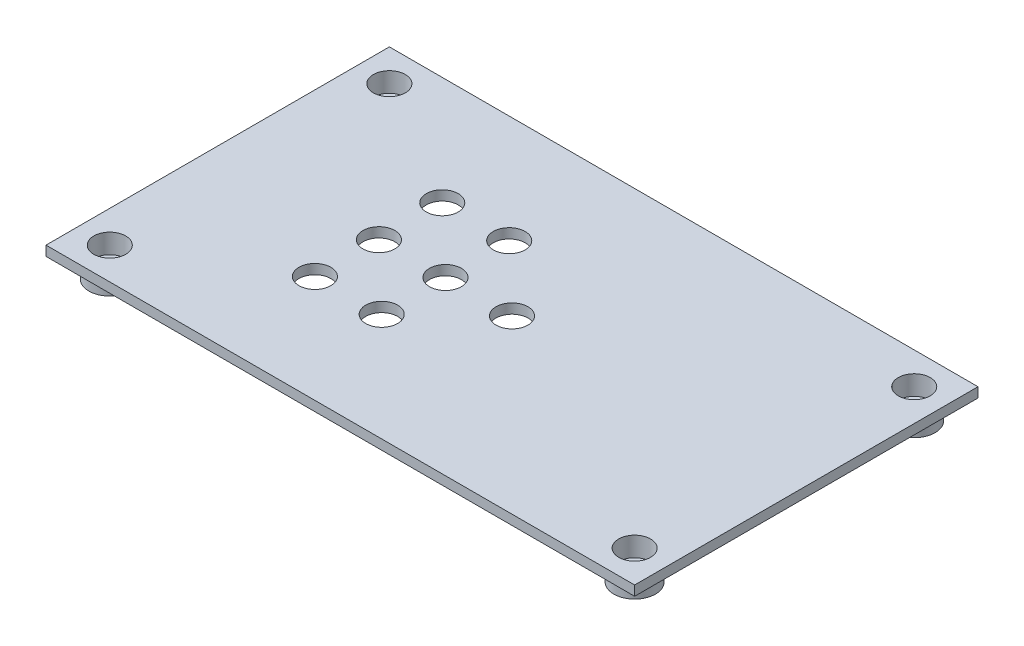
ISO-10303-21;
HEADER;
FILE_DESCRIPTION(('STEP AP214'),'2;1');
FILE_NAME('part.step','',(''),(''),'','','');
FILE_SCHEMA(('AUTOMOTIVE_DESIGN { 1 0 10303 214 1 1 1 1 }'));
ENDSEC;
DATA;
#1=APPLICATION_CONTEXT('core data for automotive mechanical design processes');
#2=APPLICATION_PROTOCOL_DEFINITION('international standard','automotive_design',2000,#1);
#3=PRODUCT_CONTEXT('',#1,'mechanical');
#4=PRODUCT('Part','Part','',(#3));
#5=PRODUCT_RELATED_PRODUCT_CATEGORY('part','',(#4));
#6=PRODUCT_DEFINITION_FORMATION('','',#4);
#7=PRODUCT_DEFINITION_CONTEXT('part definition',#1,'design');
#8=PRODUCT_DEFINITION('design','',#6,#7);
#9=PRODUCT_DEFINITION_SHAPE('','',#8);
#10=(LENGTH_UNIT() NAMED_UNIT(*) SI_UNIT(.MILLI.,.METRE.));
#11=(NAMED_UNIT(*) PLANE_ANGLE_UNIT() SI_UNIT($,.RADIAN.));
#12=(NAMED_UNIT(*) SI_UNIT($,.STERADIAN.) SOLID_ANGLE_UNIT());
#13=UNCERTAINTY_MEASURE_WITH_UNIT(LENGTH_MEASURE(1.E-05),#10,'distance_accuracy_value','');
#14=(GEOMETRIC_REPRESENTATION_CONTEXT(3) GLOBAL_UNCERTAINTY_ASSIGNED_CONTEXT((#13)) GLOBAL_UNIT_ASSIGNED_CONTEXT((#10,
#11,#12)) REPRESENTATION_CONTEXT('',''));
#15=CARTESIAN_POINT('',(0.,0.,0.));
#16=DIRECTION('',(0.,0.,1.));
#17=DIRECTION('',(1.,0.,0.));
#18=AXIS2_PLACEMENT_3D('',#15,#16,#17);
#19=CARTESIAN_POINT('',(53.5,-6.,28.5));
#20=DIRECTION('',(0.,1.,0.));
#21=DIRECTION('',(0.,0.,1.));
#22=AXIS2_PLACEMENT_3D('',#19,#20,#21);
#23=CYLINDRICAL_SURFACE('',#22,1.75);
#24=CARTESIAN_POINT('',(53.5,-4.,28.5));
#25=DIRECTION('',(0.,1.,0.));
#26=DIRECTION('',(0.,0.,1.));
#27=AXIS2_PLACEMENT_3D('',#24,#25,#26);
#28=CIRCLE('',#27,1.75);
#29=CARTESIAN_POINT('',(53.5,-4.,30.25));
#30=VERTEX_POINT('',#29);
#31=EDGE_CURVE('E155',#30,#30,#28,.T.);
#32=ORIENTED_EDGE('',*,*,#31,.F.);
#33=EDGE_LOOP('',(#32));
#34=FACE_BOUND('',#33,.T.);
#35=CARTESIAN_POINT('',(53.5,-2.,28.5));
#36=DIRECTION('',(0.,1.,0.));
#37=DIRECTION('',(0.,0.,1.));
#38=AXIS2_PLACEMENT_3D('',#35,#36,#37);
#39=CIRCLE('',#38,1.75);
#40=CARTESIAN_POINT('',(53.5,-2.,30.25));
#41=VERTEX_POINT('',#40);
#42=EDGE_CURVE('E39',#41,#41,#39,.F.);
#43=ORIENTED_EDGE('',*,*,#42,.F.);
#44=EDGE_LOOP('',(#43));
#45=FACE_BOUND('',#44,.T.);
#46=ADVANCED_FACE('F35',(#34,#45),#23,.F.);
#47=CARTESIAN_POINT('',(-53.5,-6.,-28.5));
#48=DIRECTION('',(0.,1.,0.));
#49=DIRECTION('',(0.,0.,1.));
#50=AXIS2_PLACEMENT_3D('',#47,#48,#49);
#51=CYLINDRICAL_SURFACE('',#50,1.75);
#52=CARTESIAN_POINT('',(-53.5,-4.,-28.5));
#53=DIRECTION('',(0.,1.,0.));
#54=DIRECTION('',(0.,0.,1.));
#55=AXIS2_PLACEMENT_3D('',#52,#53,#54);
#56=CIRCLE('',#55,1.75);
#57=CARTESIAN_POINT('',(-53.5,-4.,-26.75));
#58=VERTEX_POINT('',#57);
#59=EDGE_CURVE('E158',#58,#58,#56,.T.);
#60=ORIENTED_EDGE('',*,*,#59,.F.);
#61=EDGE_LOOP('',(#60));
#62=FACE_BOUND('',#61,.T.);
#63=CARTESIAN_POINT('',(-53.5,-2.,-28.5));
#64=DIRECTION('',(0.,1.,0.));
#65=DIRECTION('',(0.,0.,1.));
#66=AXIS2_PLACEMENT_3D('',#63,#64,#65);
#67=CIRCLE('',#66,1.75);
#68=CARTESIAN_POINT('',(-53.5,-2.,-26.75));
#69=VERTEX_POINT('',#68);
#70=EDGE_CURVE('E174',#69,#69,#67,.F.);
#71=ORIENTED_EDGE('',*,*,#70,.F.);
#72=EDGE_LOOP('',(#71));
#73=FACE_BOUND('',#72,.T.);
#74=ADVANCED_FACE('F184',(#62,#73),#51,.F.);
#75=CARTESIAN_POINT('',(-53.5,-6.,28.5));
#76=DIRECTION('',(0.,1.,0.));
#77=DIRECTION('',(0.,0.,1.));
#78=AXIS2_PLACEMENT_3D('',#75,#76,#77);
#79=CYLINDRICAL_SURFACE('',#78,1.75);
#80=CARTESIAN_POINT('',(-53.5,-4.,28.5));
#81=DIRECTION('',(0.,1.,0.));
#82=DIRECTION('',(0.,0.,1.));
#83=AXIS2_PLACEMENT_3D('',#80,#81,#82);
#84=CIRCLE('',#83,1.75);
#85=CARTESIAN_POINT('',(-53.5,-4.,30.25));
#86=VERTEX_POINT('',#85);
#87=EDGE_CURVE('E161',#86,#86,#84,.T.);
#88=ORIENTED_EDGE('',*,*,#87,.F.);
#89=EDGE_LOOP('',(#88));
#90=FACE_BOUND('',#89,.T.);
#91=CARTESIAN_POINT('',(-53.5,-2.,28.5));
#92=DIRECTION('',(0.,1.,0.));
#93=DIRECTION('',(0.,0.,1.));
#94=AXIS2_PLACEMENT_3D('',#91,#92,#93);
#95=CIRCLE('',#94,1.75);
#96=CARTESIAN_POINT('',(-53.5,-2.,30.25));
#97=VERTEX_POINT('',#96);
#98=EDGE_CURVE('E171',#97,#97,#95,.F.);
#99=ORIENTED_EDGE('',*,*,#98,.F.);
#100=EDGE_LOOP('',(#99));
#101=FACE_BOUND('',#100,.T.);
#102=ADVANCED_FACE('F190',(#90,#101),#79,.F.);
#103=CARTESIAN_POINT('',(53.5,-6.,-28.5));
#104=DIRECTION('',(0.,1.,0.));
#105=DIRECTION('',(0.,0.,1.));
#106=AXIS2_PLACEMENT_3D('',#103,#104,#105);
#107=CYLINDRICAL_SURFACE('',#106,1.75);
#108=CARTESIAN_POINT('',(53.5,-4.,-28.5));
#109=DIRECTION('',(0.,1.,0.));
#110=DIRECTION('',(0.,0.,1.));
#111=AXIS2_PLACEMENT_3D('',#108,#109,#110);
#112=CIRCLE('',#111,1.75);
#113=CARTESIAN_POINT('',(53.5,-4.,-26.75));
#114=VERTEX_POINT('',#113);
#115=EDGE_CURVE('E164',#114,#114,#112,.T.);
#116=ORIENTED_EDGE('',*,*,#115,.F.);
#117=EDGE_LOOP('',(#116));
#118=FACE_BOUND('',#117,.T.);
#119=CARTESIAN_POINT('',(53.5,-2.,-28.5));
#120=DIRECTION('',(0.,1.,0.));
#121=DIRECTION('',(0.,0.,1.));
#122=AXIS2_PLACEMENT_3D('',#119,#120,#121);
#123=CIRCLE('',#122,1.75);
#124=CARTESIAN_POINT('',(53.5,-2.,-26.75));
#125=VERTEX_POINT('',#124);
#126=EDGE_CURVE('E168',#125,#125,#123,.F.);
#127=ORIENTED_EDGE('',*,*,#126,.F.);
#128=EDGE_LOOP('',(#127));
#129=FACE_BOUND('',#128,.T.);
#130=ADVANCED_FACE('F197',(#118,#129),#107,.F.);
#131=CARTESIAN_POINT('',(-60.,2.,-35.));
#132=DIRECTION('',(0.,0.,-1.));
#133=DIRECTION('',(-1.,0.,0.));
#134=AXIS2_PLACEMENT_3D('',#131,#132,#133);
#135=PLANE('',#134);
#136=DIRECTION('',(1.,0.,0.));
#137=VECTOR('',#136,1.);
#138=CARTESIAN_POINT('',(-60.,0.,-35.));
#139=LINE('',#138,#137);
#140=CARTESIAN_POINT('',(-60.,0.,-35.));
#141=VERTEX_POINT('',#140);
#142=CARTESIAN_POINT('',(60.,0.,-35.));
#143=VERTEX_POINT('',#142);
#144=EDGE_CURVE('E107',#141,#143,#139,.T.);
#145=ORIENTED_EDGE('',*,*,#144,.F.);
#146=DIRECTION('',(0.,-1.,0.));
#147=VECTOR('',#146,1.);
#148=CARTESIAN_POINT('',(-60.,2.,-35.));
#149=LINE('',#148,#147);
#150=CARTESIAN_POINT('',(-60.,2.,-35.));
#151=VERTEX_POINT('',#150);
#152=EDGE_CURVE('E54',#151,#141,#149,.T.);
#153=ORIENTED_EDGE('',*,*,#152,.F.);
#154=DIRECTION('',(1.,0.,0.));
#155=VECTOR('',#154,1.);
#156=CARTESIAN_POINT('',(-60.,2.,-35.));
#157=LINE('',#156,#155);
#158=CARTESIAN_POINT('',(60.,2.,-35.));
#159=VERTEX_POINT('',#158);
#160=EDGE_CURVE('E101',#151,#159,#157,.T.);
#161=ORIENTED_EDGE('',*,*,#160,.T.);
#162=DIRECTION('',(0.,-1.,0.));
#163=VECTOR('',#162,1.);
#164=CARTESIAN_POINT('',(60.,2.,-35.));
#165=LINE('',#164,#163);
#166=EDGE_CURVE('E79',#159,#143,#165,.T.);
#167=ORIENTED_EDGE('',*,*,#166,.T.);
#168=EDGE_LOOP('',(#145,#153,#161,#167));
#169=FACE_BOUND('',#168,.T.);
#170=ADVANCED_FACE('F37',(#169),#135,.T.);
#171=CARTESIAN_POINT('',(-60.,2.,-35.));
#172=DIRECTION('',(1.,0.,0.));
#173=DIRECTION('',(0.,0.,-1.));
#174=AXIS2_PLACEMENT_3D('',#171,#172,#173);
#175=PLANE('',#174);
#176=DIRECTION('',(0.,0.,1.));
#177=VECTOR('',#176,1.);
#178=CARTESIAN_POINT('',(-60.,0.,-35.));
#179=LINE('',#178,#177);
#180=CARTESIAN_POINT('',(-60.,0.,35.));
#181=VERTEX_POINT('',#180);
#182=EDGE_CURVE('E71',#141,#181,#179,.T.);
#183=ORIENTED_EDGE('',*,*,#182,.T.);
#184=DIRECTION('',(0.,-1.,0.));
#185=VECTOR('',#184,1.);
#186=CARTESIAN_POINT('',(-60.,2.,35.));
#187=LINE('',#186,#185);
#188=CARTESIAN_POINT('',(-60.,2.,35.));
#189=VERTEX_POINT('',#188);
#190=EDGE_CURVE('E98',#189,#181,#187,.T.);
#191=ORIENTED_EDGE('',*,*,#190,.F.);
#192=DIRECTION('',(0.,0.,1.));
#193=VECTOR('',#192,1.);
#194=CARTESIAN_POINT('',(-60.,2.,-35.));
#195=LINE('',#194,#193);
#196=EDGE_CURVE('E89',#151,#189,#195,.T.);
#197=ORIENTED_EDGE('',*,*,#196,.F.);
#198=ORIENTED_EDGE('',*,*,#152,.T.);
#199=EDGE_LOOP('',(#183,#191,#197,#198));
#200=FACE_BOUND('',#199,.T.);
#201=ADVANCED_FACE('F285',(#200),#175,.F.);
#202=CARTESIAN_POINT('',(-60.,2.,35.));
#203=DIRECTION('',(0.,0.,-1.));
#204=DIRECTION('',(-1.,0.,0.));
#205=AXIS2_PLACEMENT_3D('',#202,#203,#204);
#206=PLANE('',#205);
#207=DIRECTION('',(1.,0.,0.));
#208=VECTOR('',#207,1.);
#209=CARTESIAN_POINT('',(-60.,0.,35.));
#210=LINE('',#209,#208);
#211=CARTESIAN_POINT('',(60.,0.,35.));
#212=VERTEX_POINT('',#211);
#213=EDGE_CURVE('E96',#181,#212,#210,.T.);
#214=ORIENTED_EDGE('',*,*,#213,.T.);
#215=DIRECTION('',(0.,-1.,0.));
#216=VECTOR('',#215,1.);
#217=CARTESIAN_POINT('',(60.,2.,35.));
#218=LINE('',#217,#216);
#219=CARTESIAN_POINT('',(60.,2.,35.));
#220=VERTEX_POINT('',#219);
#221=EDGE_CURVE('E93',#220,#212,#218,.T.);
#222=ORIENTED_EDGE('',*,*,#221,.F.);
#223=DIRECTION('',(1.,0.,0.));
#224=VECTOR('',#223,1.);
#225=CARTESIAN_POINT('',(-60.,2.,35.));
#226=LINE('',#225,#224);
#227=EDGE_CURVE('E84',#189,#220,#226,.T.);
#228=ORIENTED_EDGE('',*,*,#227,.F.);
#229=ORIENTED_EDGE('',*,*,#190,.T.);
#230=EDGE_LOOP('',(#214,#222,#228,#229));
#231=FACE_BOUND('',#230,.T.);
#232=ADVANCED_FACE('F94',(#231),#206,.F.);
#233=CARTESIAN_POINT('',(60.,2.,-35.));
#234=DIRECTION('',(1.,0.,0.));
#235=DIRECTION('',(0.,0.,-1.));
#236=AXIS2_PLACEMENT_3D('',#233,#234,#235);
#237=PLANE('',#236);
#238=DIRECTION('',(0.,0.,1.));
#239=VECTOR('',#238,1.);
#240=CARTESIAN_POINT('',(60.,0.,-35.));
#241=LINE('',#240,#239);
#242=EDGE_CURVE('E110',#143,#212,#241,.T.);
#243=ORIENTED_EDGE('',*,*,#242,.F.);
#244=ORIENTED_EDGE('',*,*,#166,.F.);
#245=DIRECTION('',(0.,0.,1.));
#246=VECTOR('',#245,1.);
#247=CARTESIAN_POINT('',(60.,2.,-35.));
#248=LINE('',#247,#246);
#249=EDGE_CURVE('E88',#159,#220,#248,.T.);
#250=ORIENTED_EDGE('',*,*,#249,.T.);
#251=ORIENTED_EDGE('',*,*,#221,.T.);
#252=EDGE_LOOP('',(#243,#244,#250,#251));
#253=FACE_BOUND('',#252,.T.);
#254=ADVANCED_FACE('F100',(#253),#237,.T.);
#255=CARTESIAN_POINT('',(0.,2.,0.));
#256=DIRECTION('',(0.,-1.,0.));
#257=DIRECTION('',(0.,0.,-1.));
#258=AXIS2_PLACEMENT_3D('',#255,#256,#257);
#259=PLANE('',#258);
#260=CARTESIAN_POINT('',(53.5,2.,-28.5));
#261=DIRECTION('',(0.,1.,0.));
#262=DIRECTION('',(0.,0.,1.));
#263=AXIS2_PLACEMENT_3D('',#260,#261,#262);
#264=CIRCLE('',#263,3.25);
#265=CARTESIAN_POINT('',(53.5,2.,-25.25));
#266=VERTEX_POINT('',#265);
#267=EDGE_CURVE('E625',#266,#266,#264,.T.);
#268=ORIENTED_EDGE('',*,*,#267,.F.);
#269=EDGE_LOOP('',(#268));
#270=FACE_BOUND('',#269,.T.);
#271=CARTESIAN_POINT('',(-53.5,2.,28.5));
#272=DIRECTION('',(0.,1.,0.));
#273=DIRECTION('',(0.,0.,1.));
#274=AXIS2_PLACEMENT_3D('',#271,#272,#273);
#275=CIRCLE('',#274,3.25);
#276=CARTESIAN_POINT('',(-53.5,2.,31.75));
#277=VERTEX_POINT('',#276);
#278=EDGE_CURVE('E618',#277,#277,#275,.T.);
#279=ORIENTED_EDGE('',*,*,#278,.F.);
#280=EDGE_LOOP('',(#279));
#281=FACE_BOUND('',#280,.T.);
#282=CARTESIAN_POINT('',(53.5,2.,28.5));
#283=DIRECTION('',(0.,1.,0.));
#284=DIRECTION('',(0.,0.,1.));
#285=AXIS2_PLACEMENT_3D('',#282,#283,#284);
#286=CIRCLE('',#285,3.25);
#287=CARTESIAN_POINT('',(53.5,2.,31.75));
#288=VERTEX_POINT('',#287);
#289=EDGE_CURVE('E630',#288,#288,#286,.T.);
#290=ORIENTED_EDGE('',*,*,#289,.F.);
#291=EDGE_LOOP('',(#290));
#292=FACE_BOUND('',#291,.T.);
#293=CARTESIAN_POINT('',(-53.5,2.,-28.5));
#294=DIRECTION('',(0.,1.,0.));
#295=DIRECTION('',(0.,0.,1.));
#296=AXIS2_PLACEMENT_3D('',#293,#294,#295);
#297=CIRCLE('',#296,3.25);
#298=CARTESIAN_POINT('',(-53.5,2.,-25.25));
#299=VERTEX_POINT('',#298);
#300=EDGE_CURVE('E612',#299,#299,#297,.T.);
#301=ORIENTED_EDGE('',*,*,#300,.F.);
#302=EDGE_LOOP('',(#301));
#303=FACE_BOUND('',#302,.T.);
#304=CARTESIAN_POINT('',(-13.5670814838794,2.,13.));
#305=DIRECTION('',(0.,1.,0.));
#306=DIRECTION('',(0.,0.,1.));
#307=AXIS2_PLACEMENT_3D('',#304,#305,#306);
#308=CIRCLE('',#307,3.25);
#309=CARTESIAN_POINT('',(-13.5670814838794,2.,16.25));
#310=VERTEX_POINT('',#309);
#311=EDGE_CURVE('E558',#310,#310,#308,.T.);
#312=ORIENTED_EDGE('',*,*,#311,.F.);
#313=EDGE_LOOP('',(#312));
#314=FACE_BOUND('',#313,.T.);
#315=CARTESIAN_POINT('',(-27.0544480874395,2.,13.1222734091497));
#316=DIRECTION('',(0.,1.,0.));
#317=DIRECTION('',(0.,0.,1.));
#318=AXIS2_PLACEMENT_3D('',#315,#316,#317);
#319=CIRCLE('',#318,3.25);
#320=CARTESIAN_POINT('',(-27.0544480874395,2.,16.3722734091497));
#321=VERTEX_POINT('',#320);
#322=EDGE_CURVE('E576',#321,#321,#319,.T.);
#323=ORIENTED_EDGE('',*,*,#322,.F.);
#324=EDGE_LOOP('',(#323));
#325=FACE_BOUND('',#324,.T.);
#326=CARTESIAN_POINT('',(-27.0234830475948,2.,0.107647129916502));
#327=DIRECTION('',(0.,1.,0.));
#328=DIRECTION('',(0.,0.,1.));
#329=AXIS2_PLACEMENT_3D('',#326,#327,#328);
#330=CIRCLE('',#329,3.25);
#331=CARTESIAN_POINT('',(-27.0234830475948,2.,3.3576471299165));
#332=VERTEX_POINT('',#331);
#333=EDGE_CURVE('E573',#332,#332,#330,.T.);
#334=ORIENTED_EDGE('',*,*,#333,.F.);
#335=EDGE_LOOP('',(#334));
#336=FACE_BOUND('',#335,.T.);
#337=CARTESIAN_POINT('',(-27.0815622735967,2.,-12.8640198972437));
#338=DIRECTION('',(0.,1.,0.));
#339=DIRECTION('',(0.,0.,1.));
#340=AXIS2_PLACEMENT_3D('',#337,#338,#339);
#341=CIRCLE('',#340,3.25);
#342=CARTESIAN_POINT('',(-27.0815622735967,2.,-9.6140198972437));
#343=VERTEX_POINT('',#342);
#344=EDGE_CURVE('E570',#343,#343,#341,.T.);
#345=ORIENTED_EDGE('',*,*,#344,.F.);
#346=EDGE_LOOP('',(#345));
#347=FACE_BOUND('',#346,.T.);
#348=CARTESIAN_POINT('',(0.,2.,0.));
#349=DIRECTION('',(0.,1.,0.));
#350=DIRECTION('',(0.,0.,1.));
#351=AXIS2_PLACEMENT_3D('',#348,#349,#350);
#352=CIRCLE('',#351,3.25);
#353=CARTESIAN_POINT('',(0.,2.,3.25));
#354=VERTEX_POINT('',#353);
#355=EDGE_CURVE('E567',#354,#354,#352,.T.);
#356=ORIENTED_EDGE('',*,*,#355,.F.);
#357=EDGE_LOOP('',(#356));
#358=FACE_BOUND('',#357,.T.);
#359=CARTESIAN_POINT('',(-13.5670814838794,2.,0.));
#360=DIRECTION('',(0.,1.,0.));
#361=DIRECTION('',(0.,0.,1.));
#362=AXIS2_PLACEMENT_3D('',#359,#360,#361);
#363=CIRCLE('',#362,3.25);
#364=CARTESIAN_POINT('',(-13.5670814838794,2.,3.25));
#365=VERTEX_POINT('',#364);
#366=EDGE_CURVE('E564',#365,#365,#363,.T.);
#367=ORIENTED_EDGE('',*,*,#366,.F.);
#368=EDGE_LOOP('',(#367));
#369=FACE_BOUND('',#368,.T.);
#370=CARTESIAN_POINT('',(-13.5670814838794,2.,-13.));
#371=DIRECTION('',(0.,1.,0.));
#372=DIRECTION('',(0.,0.,1.));
#373=AXIS2_PLACEMENT_3D('',#370,#371,#372);
#374=CIRCLE('',#373,3.25);
#375=CARTESIAN_POINT('',(-13.5670814838794,2.,-9.75));
#376=VERTEX_POINT('',#375);
#377=EDGE_CURVE('E129',#376,#376,#374,.T.);
#378=ORIENTED_EDGE('',*,*,#377,.F.);
#379=EDGE_LOOP('',(#378));
#380=FACE_BOUND('',#379,.T.);
#381=ORIENTED_EDGE('',*,*,#160,.F.);
#382=ORIENTED_EDGE('',*,*,#196,.T.);
#383=ORIENTED_EDGE('',*,*,#227,.T.);
#384=ORIENTED_EDGE('',*,*,#249,.F.);
#385=EDGE_LOOP('',(#381,#382,#383,#384));
#386=FACE_BOUND('',#385,.T.);
#387=ADVANCED_FACE('F87',(#270,#281,#292,#303,#314,#325,#336,#347,#358,#369,#380,#386),#259,.F.);
#388=CARTESIAN_POINT('',(0.,0.,0.));
#389=DIRECTION('',(0.,-1.,0.));
#390=DIRECTION('',(0.,0.,-1.));
#391=AXIS2_PLACEMENT_3D('',#388,#389,#390);
#392=PLANE('',#391);
#393=CARTESIAN_POINT('',(53.5,0.,28.5));
#394=DIRECTION('',(0.,-1.,0.));
#395=DIRECTION('',(0.,0.,-1.));
#396=AXIS2_PLACEMENT_3D('',#393,#394,#395);
#397=CIRCLE('',#396,4.25);
#398=CARTESIAN_POINT('',(53.5,0.,24.25));
#399=VERTEX_POINT('',#398);
#400=EDGE_CURVE('E11',#399,#399,#397,.T.);
#401=ORIENTED_EDGE('',*,*,#400,.F.);
#402=EDGE_LOOP('',(#401));
#403=FACE_BOUND('',#402,.T.);
#404=CARTESIAN_POINT('',(-53.5,0.,-28.5));
#405=DIRECTION('',(0.,-1.,0.));
#406=DIRECTION('',(0.,0.,-1.));
#407=AXIS2_PLACEMENT_3D('',#404,#405,#406);
#408=CIRCLE('',#407,4.25);
#409=CARTESIAN_POINT('',(-53.5,0.,-32.75));
#410=VERTEX_POINT('',#409);
#411=EDGE_CURVE('E45',#410,#410,#408,.T.);
#412=ORIENTED_EDGE('',*,*,#411,.F.);
#413=EDGE_LOOP('',(#412));
#414=FACE_BOUND('',#413,.T.);
#415=CARTESIAN_POINT('',(-53.5,0.,28.5));
#416=DIRECTION('',(0.,-1.,0.));
#417=DIRECTION('',(0.,0.,-1.));
#418=AXIS2_PLACEMENT_3D('',#415,#416,#417);
#419=CIRCLE('',#418,4.25);
#420=CARTESIAN_POINT('',(-53.5,0.,24.25));
#421=VERTEX_POINT('',#420);
#422=EDGE_CURVE('E150',#421,#421,#419,.T.);
#423=ORIENTED_EDGE('',*,*,#422,.F.);
#424=EDGE_LOOP('',(#423));
#425=FACE_BOUND('',#424,.T.);
#426=CARTESIAN_POINT('',(53.5,0.,-28.5));
#427=DIRECTION('',(0.,-1.,0.));
#428=DIRECTION('',(0.,0.,-1.));
#429=AXIS2_PLACEMENT_3D('',#426,#427,#428);
#430=CIRCLE('',#429,4.25);
#431=CARTESIAN_POINT('',(53.5,0.,-32.75));
#432=VERTEX_POINT('',#431);
#433=EDGE_CURVE('E124',#432,#432,#430,.T.);
#434=ORIENTED_EDGE('',*,*,#433,.F.);
#435=EDGE_LOOP('',(#434));
#436=FACE_BOUND('',#435,.T.);
#437=CARTESIAN_POINT('',(-13.5670814838794,0.,13.));
#438=DIRECTION('',(0.,-1.,0.));
#439=DIRECTION('',(0.,0.,-1.));
#440=AXIS2_PLACEMENT_3D('',#437,#438,#439);
#441=CIRCLE('',#440,3.25);
#442=CARTESIAN_POINT('',(-13.5670814838794,0.,9.75));
#443=VERTEX_POINT('',#442);
#444=EDGE_CURVE('E144',#443,#443,#441,.T.);
#445=ORIENTED_EDGE('',*,*,#444,.F.);
#446=EDGE_LOOP('',(#445));
#447=FACE_BOUND('',#446,.T.);
#448=CARTESIAN_POINT('',(-27.0544480874395,0.,13.1222734091497));
#449=DIRECTION('',(0.,-1.,0.));
#450=DIRECTION('',(0.,0.,-1.));
#451=AXIS2_PLACEMENT_3D('',#448,#449,#450);
#452=CIRCLE('',#451,3.25);
#453=CARTESIAN_POINT('',(-27.0544480874395,0.,9.87227340914968));
#454=VERTEX_POINT('',#453);
#455=EDGE_CURVE('E141',#454,#454,#452,.T.);
#456=ORIENTED_EDGE('',*,*,#455,.F.);
#457=EDGE_LOOP('',(#456));
#458=FACE_BOUND('',#457,.T.);
#459=CARTESIAN_POINT('',(-27.0234830475948,0.,0.107647129916502));
#460=DIRECTION('',(0.,-1.,0.));
#461=DIRECTION('',(0.,0.,-1.));
#462=AXIS2_PLACEMENT_3D('',#459,#460,#461);
#463=CIRCLE('',#462,3.25);
#464=CARTESIAN_POINT('',(-27.0234830475948,0.,-3.1423528700835));
#465=VERTEX_POINT('',#464);
#466=EDGE_CURVE('E138',#465,#465,#463,.T.);
#467=ORIENTED_EDGE('',*,*,#466,.F.);
#468=EDGE_LOOP('',(#467));
#469=FACE_BOUND('',#468,.T.);
#470=CARTESIAN_POINT('',(-27.0815622735967,0.,-12.8640198972437));
#471=DIRECTION('',(0.,-1.,0.));
#472=DIRECTION('',(0.,0.,-1.));
#473=AXIS2_PLACEMENT_3D('',#470,#471,#472);
#474=CIRCLE('',#473,3.25);
#475=CARTESIAN_POINT('',(-27.0815622735967,0.,-16.1140198972437));
#476=VERTEX_POINT('',#475);
#477=EDGE_CURVE('E135',#476,#476,#474,.T.);
#478=ORIENTED_EDGE('',*,*,#477,.F.);
#479=EDGE_LOOP('',(#478));
#480=FACE_BOUND('',#479,.T.);
#481=CARTESIAN_POINT('',(0.,0.,0.));
#482=DIRECTION('',(0.,-1.,0.));
#483=DIRECTION('',(0.,0.,-1.));
#484=AXIS2_PLACEMENT_3D('',#481,#482,#483);
#485=CIRCLE('',#484,3.25);
#486=CARTESIAN_POINT('',(0.,0.,-3.25));
#487=VERTEX_POINT('',#486);
#488=EDGE_CURVE('E132',#487,#487,#485,.T.);
#489=ORIENTED_EDGE('',*,*,#488,.F.);
#490=EDGE_LOOP('',(#489));
#491=FACE_BOUND('',#490,.T.);
#492=CARTESIAN_POINT('',(-13.5670814838794,0.,0.));
#493=DIRECTION('',(0.,-1.,0.));
#494=DIRECTION('',(0.,0.,-1.));
#495=AXIS2_PLACEMENT_3D('',#492,#493,#494);
#496=CIRCLE('',#495,3.25);
#497=CARTESIAN_POINT('',(-13.5670814838794,0.,-3.25));
#498=VERTEX_POINT('',#497);
#499=EDGE_CURVE('E128',#498,#498,#496,.T.);
#500=ORIENTED_EDGE('',*,*,#499,.F.);
#501=EDGE_LOOP('',(#500));
#502=FACE_BOUND('',#501,.T.);
#503=CARTESIAN_POINT('',(-13.5670814838794,0.,-13.));
#504=DIRECTION('',(0.,-1.,0.));
#505=DIRECTION('',(0.,0.,-1.));
#506=AXIS2_PLACEMENT_3D('',#503,#504,#505);
#507=CIRCLE('',#506,3.25);
#508=CARTESIAN_POINT('',(-13.5670814838794,0.,-16.25));
#509=VERTEX_POINT('',#508);
#510=EDGE_CURVE('E125',#509,#509,#507,.T.);
#511=ORIENTED_EDGE('',*,*,#510,.F.);
#512=EDGE_LOOP('',(#511));
#513=FACE_BOUND('',#512,.T.);
#514=CARTESIAN_POINT('',(0.,0.,-13.));
#515=DIRECTION('',(0.,-1.,0.));
#516=DIRECTION('',(0.,0.,-1.));
#517=AXIS2_PLACEMENT_3D('',#514,#515,#516);
#518=CIRCLE('',#517,2.);
#519=CARTESIAN_POINT('',(0.,0.,-15.));
#520=VERTEX_POINT('',#519);
#521=EDGE_CURVE('E121',#520,#520,#518,.T.);
#522=ORIENTED_EDGE('',*,*,#521,.F.);
#523=EDGE_LOOP('',(#522));
#524=FACE_BOUND('',#523,.T.);
#525=CARTESIAN_POINT('',(0.,0.,13.));
#526=DIRECTION('',(0.,-1.,0.));
#527=DIRECTION('',(0.,0.,-1.));
#528=AXIS2_PLACEMENT_3D('',#525,#526,#527);
#529=CIRCLE('',#528,2.);
#530=CARTESIAN_POINT('',(0.,0.,11.));
#531=VERTEX_POINT('',#530);
#532=EDGE_CURVE('E116',#531,#531,#529,.T.);
#533=ORIENTED_EDGE('',*,*,#532,.F.);
#534=EDGE_LOOP('',(#533));
#535=FACE_BOUND('',#534,.T.);
#536=ORIENTED_EDGE('',*,*,#144,.T.);
#537=ORIENTED_EDGE('',*,*,#242,.T.);
#538=ORIENTED_EDGE('',*,*,#213,.F.);
#539=ORIENTED_EDGE('',*,*,#182,.F.);
#540=EDGE_LOOP('',(#536,#537,#538,#539));
#541=FACE_BOUND('',#540,.T.);
#542=ADVANCED_FACE('F277',(#403,#414,#425,#436,#447,#458,#469,#480,#491,#502,#513,#524,#535,
#541),#392,.T.);
#543=CARTESIAN_POINT('',(0.,-9.,13.));
#544=DIRECTION('',(0.,1.,0.));
#545=DIRECTION('',(0.,0.,1.));
#546=AXIS2_PLACEMENT_3D('',#543,#544,#545);
#547=CYLINDRICAL_SURFACE('',#546,2.);
#548=ORIENTED_EDGE('',*,*,#532,.T.);
#549=EDGE_LOOP('',(#548));
#550=FACE_BOUND('',#549,.T.);
#551=CARTESIAN_POINT('',(0.,-9.,13.));
#552=DIRECTION('',(0.,1.,0.));
#553=DIRECTION('',(0.,0.,1.));
#554=AXIS2_PLACEMENT_3D('',#551,#552,#553);
#555=CIRCLE('',#554,2.);
#556=CARTESIAN_POINT('',(0.,-9.,15.));
#557=VERTEX_POINT('',#556);
#558=EDGE_CURVE('E111',#557,#557,#555,.T.);
#559=ORIENTED_EDGE('',*,*,#558,.T.);
#560=EDGE_LOOP('',(#559));
#561=FACE_BOUND('',#560,.T.);
#562=ADVANCED_FACE('F273',(#550,#561),#547,.T.);
#563=CARTESIAN_POINT('',(0.,-9.,13.));
#564=DIRECTION('',(0.,1.,0.));
#565=DIRECTION('',(0.,0.,1.));
#566=AXIS2_PLACEMENT_3D('',#563,#564,#565);
#567=PLANE('',#566);
#568=ORIENTED_EDGE('',*,*,#558,.F.);
#569=EDGE_LOOP('',(#568));
#570=FACE_BOUND('',#569,.T.);
#571=ADVANCED_FACE('F269',(#570),#567,.F.);
#572=CARTESIAN_POINT('',(0.,-9.,-13.));
#573=DIRECTION('',(0.,1.,0.));
#574=DIRECTION('',(0.,0.,1.));
#575=AXIS2_PLACEMENT_3D('',#572,#573,#574);
#576=CYLINDRICAL_SURFACE('',#575,2.);
#577=ORIENTED_EDGE('',*,*,#521,.T.);
#578=EDGE_LOOP('',(#577));
#579=FACE_BOUND('',#578,.T.);
#580=CARTESIAN_POINT('',(0.,-9.,-13.));
#581=DIRECTION('',(0.,1.,0.));
#582=DIRECTION('',(0.,0.,1.));
#583=AXIS2_PLACEMENT_3D('',#580,#581,#582);
#584=CIRCLE('',#583,2.);
#585=CARTESIAN_POINT('',(0.,-9.,-11.));
#586=VERTEX_POINT('',#585);
#587=EDGE_CURVE('E147',#586,#586,#584,.T.);
#588=ORIENTED_EDGE('',*,*,#587,.T.);
#589=EDGE_LOOP('',(#588));
#590=FACE_BOUND('',#589,.T.);
#591=ADVANCED_FACE('F265',(#579,#590),#576,.T.);
#592=CARTESIAN_POINT('',(0.,-9.,-13.));
#593=DIRECTION('',(0.,1.,0.));
#594=DIRECTION('',(0.,0.,1.));
#595=AXIS2_PLACEMENT_3D('',#592,#593,#594);
#596=PLANE('',#595);
#597=ORIENTED_EDGE('',*,*,#587,.F.);
#598=EDGE_LOOP('',(#597));
#599=FACE_BOUND('',#598,.T.);
#600=ADVANCED_FACE('F261',(#599),#596,.F.);
#601=CARTESIAN_POINT('',(-13.5670814838794,-9.,-13.));
#602=DIRECTION('',(0.,1.,0.));
#603=DIRECTION('',(0.,0.,1.));
#604=AXIS2_PLACEMENT_3D('',#601,#602,#603);
#605=CYLINDRICAL_SURFACE('',#604,3.25);
#606=ORIENTED_EDGE('',*,*,#510,.T.);
#607=EDGE_LOOP('',(#606));
#608=FACE_BOUND('',#607,.T.);
#609=ORIENTED_EDGE('',*,*,#377,.T.);
#610=EDGE_LOOP('',(#609));
#611=FACE_BOUND('',#610,.T.);
#612=ADVANCED_FACE('F239',(#608,#611),#605,.F.);
#613=CARTESIAN_POINT('',(-13.5670814838794,-9.,0.));
#614=DIRECTION('',(0.,1.,0.));
#615=DIRECTION('',(0.,0.,1.));
#616=AXIS2_PLACEMENT_3D('',#613,#614,#615);
#617=CYLINDRICAL_SURFACE('',#616,3.25);
#618=ORIENTED_EDGE('',*,*,#499,.T.);
#619=EDGE_LOOP('',(#618));
#620=FACE_BOUND('',#619,.T.);
#621=ORIENTED_EDGE('',*,*,#366,.T.);
#622=EDGE_LOOP('',(#621));
#623=FACE_BOUND('',#622,.T.);
#624=ADVANCED_FACE('F235',(#620,#623),#617,.F.);
#625=CARTESIAN_POINT('',(0.,-9.,0.));
#626=DIRECTION('',(0.,1.,0.));
#627=DIRECTION('',(0.,0.,1.));
#628=AXIS2_PLACEMENT_3D('',#625,#626,#627);
#629=CYLINDRICAL_SURFACE('',#628,3.25);
#630=ORIENTED_EDGE('',*,*,#488,.T.);
#631=EDGE_LOOP('',(#630));
#632=FACE_BOUND('',#631,.T.);
#633=ORIENTED_EDGE('',*,*,#355,.T.);
#634=EDGE_LOOP('',(#633));
#635=FACE_BOUND('',#634,.T.);
#636=ADVANCED_FACE('F238',(#632,#635),#629,.F.);
#637=CARTESIAN_POINT('',(-27.0815622735967,-9.,-12.8640198972437));
#638=DIRECTION('',(0.,1.,0.));
#639=DIRECTION('',(0.,0.,1.));
#640=AXIS2_PLACEMENT_3D('',#637,#638,#639);
#641=CYLINDRICAL_SURFACE('',#640,3.25);
#642=ORIENTED_EDGE('',*,*,#477,.T.);
#643=EDGE_LOOP('',(#642));
#644=FACE_BOUND('',#643,.T.);
#645=ORIENTED_EDGE('',*,*,#344,.T.);
#646=EDGE_LOOP('',(#645));
#647=FACE_BOUND('',#646,.T.);
#648=ADVANCED_FACE('F243',(#644,#647),#641,.F.);
#649=CARTESIAN_POINT('',(-27.0234830475948,-9.,0.107647129916502));
#650=DIRECTION('',(0.,1.,0.));
#651=DIRECTION('',(0.,0.,1.));
#652=AXIS2_PLACEMENT_3D('',#649,#650,#651);
#653=CYLINDRICAL_SURFACE('',#652,3.25);
#654=ORIENTED_EDGE('',*,*,#466,.T.);
#655=EDGE_LOOP('',(#654));
#656=FACE_BOUND('',#655,.T.);
#657=ORIENTED_EDGE('',*,*,#333,.T.);
#658=EDGE_LOOP('',(#657));
#659=FACE_BOUND('',#658,.T.);
#660=ADVANCED_FACE('F247',(#656,#659),#653,.F.);
#661=CARTESIAN_POINT('',(-27.0544480874395,-9.,13.1222734091497));
#662=DIRECTION('',(0.,1.,0.));
#663=DIRECTION('',(0.,0.,1.));
#664=AXIS2_PLACEMENT_3D('',#661,#662,#663);
#665=CYLINDRICAL_SURFACE('',#664,3.25);
#666=ORIENTED_EDGE('',*,*,#455,.T.);
#667=EDGE_LOOP('',(#666));
#668=FACE_BOUND('',#667,.T.);
#669=ORIENTED_EDGE('',*,*,#322,.T.);
#670=EDGE_LOOP('',(#669));
#671=FACE_BOUND('',#670,.T.);
#672=ADVANCED_FACE('F251',(#668,#671),#665,.F.);
#673=CARTESIAN_POINT('',(-13.5670814838794,-9.,13.));
#674=DIRECTION('',(0.,1.,0.));
#675=DIRECTION('',(0.,0.,1.));
#676=AXIS2_PLACEMENT_3D('',#673,#674,#675);
#677=CYLINDRICAL_SURFACE('',#676,3.25);
#678=ORIENTED_EDGE('',*,*,#444,.T.);
#679=EDGE_LOOP('',(#678));
#680=FACE_BOUND('',#679,.T.);
#681=ORIENTED_EDGE('',*,*,#311,.T.);
#682=EDGE_LOOP('',(#681));
#683=FACE_BOUND('',#682,.T.);
#684=ADVANCED_FACE('F233',(#680,#683),#677,.F.);
#685=CARTESIAN_POINT('',(53.5,-4.,-28.5));
#686=DIRECTION('',(0.,1.,0.));
#687=DIRECTION('',(0.,0.,1.));
#688=AXIS2_PLACEMENT_3D('',#685,#686,#687);
#689=CYLINDRICAL_SURFACE('',#688,4.25);
#690=ORIENTED_EDGE('',*,*,#433,.T.);
#691=EDGE_LOOP('',(#690));
#692=FACE_BOUND('',#691,.T.);
#693=CARTESIAN_POINT('',(53.5,-4.,-28.5));
#694=DIRECTION('',(0.,1.,0.));
#695=DIRECTION('',(0.,0.,1.));
#696=AXIS2_PLACEMENT_3D('',#693,#694,#695);
#697=CIRCLE('',#696,4.25);
#698=CARTESIAN_POINT('',(53.5,-4.,-24.25));
#699=VERTEX_POINT('',#698);
#700=EDGE_CURVE('E554',#699,#699,#697,.T.);
#701=ORIENTED_EDGE('',*,*,#700,.T.);
#702=EDGE_LOOP('',(#701));
#703=FACE_BOUND('',#702,.T.);
#704=ADVANCED_FACE('F229',(#692,#703),#689,.T.);
#705=CARTESIAN_POINT('',(53.5,-4.,-28.5));
#706=DIRECTION('',(0.,1.,0.));
#707=DIRECTION('',(0.,0.,1.));
#708=AXIS2_PLACEMENT_3D('',#705,#706,#707);
#709=PLANE('',#708);
#710=ORIENTED_EDGE('',*,*,#115,.T.);
#711=EDGE_LOOP('',(#710));
#712=FACE_BOUND('',#711,.T.);
#713=ORIENTED_EDGE('',*,*,#700,.F.);
#714=EDGE_LOOP('',(#713));
#715=FACE_BOUND('',#714,.T.);
#716=ADVANCED_FACE('F225',(#712,#715),#709,.F.);
#717=CARTESIAN_POINT('',(-53.5,-4.,28.5));
#718=DIRECTION('',(0.,1.,0.));
#719=DIRECTION('',(0.,0.,1.));
#720=AXIS2_PLACEMENT_3D('',#717,#718,#719);
#721=CYLINDRICAL_SURFACE('',#720,4.25);
#722=ORIENTED_EDGE('',*,*,#422,.T.);
#723=EDGE_LOOP('',(#722));
#724=FACE_BOUND('',#723,.T.);
#725=CARTESIAN_POINT('',(-53.5,-4.,28.5));
#726=DIRECTION('',(0.,1.,0.));
#727=DIRECTION('',(0.,0.,1.));
#728=AXIS2_PLACEMENT_3D('',#725,#726,#727);
#729=CIRCLE('',#728,4.25);
#730=CARTESIAN_POINT('',(-53.5,-4.,32.75));
#731=VERTEX_POINT('',#730);
#732=EDGE_CURVE('E552',#731,#731,#729,.T.);
#733=ORIENTED_EDGE('',*,*,#732,.T.);
#734=EDGE_LOOP('',(#733));
#735=FACE_BOUND('',#734,.T.);
#736=ADVANCED_FACE('F221',(#724,#735),#721,.T.);
#737=CARTESIAN_POINT('',(-53.5,-4.,28.5));
#738=DIRECTION('',(0.,1.,0.));
#739=DIRECTION('',(0.,0.,1.));
#740=AXIS2_PLACEMENT_3D('',#737,#738,#739);
#741=PLANE('',#740);
#742=ORIENTED_EDGE('',*,*,#87,.T.);
#743=EDGE_LOOP('',(#742));
#744=FACE_BOUND('',#743,.T.);
#745=ORIENTED_EDGE('',*,*,#732,.F.);
#746=EDGE_LOOP('',(#745));
#747=FACE_BOUND('',#746,.T.);
#748=ADVANCED_FACE('F217',(#744,#747),#741,.F.);
#749=CARTESIAN_POINT('',(-53.5,-4.,-28.5));
#750=DIRECTION('',(0.,1.,0.));
#751=DIRECTION('',(0.,0.,1.));
#752=AXIS2_PLACEMENT_3D('',#749,#750,#751);
#753=CYLINDRICAL_SURFACE('',#752,4.25);
#754=ORIENTED_EDGE('',*,*,#411,.T.);
#755=EDGE_LOOP('',(#754));
#756=FACE_BOUND('',#755,.T.);
#757=CARTESIAN_POINT('',(-53.5,-4.,-28.5));
#758=DIRECTION('',(0.,1.,0.));
#759=DIRECTION('',(0.,0.,1.));
#760=AXIS2_PLACEMENT_3D('',#757,#758,#759);
#761=CIRCLE('',#760,4.25);
#762=CARTESIAN_POINT('',(-53.5,-4.,-24.25));
#763=VERTEX_POINT('',#762);
#764=EDGE_CURVE('E555',#763,#763,#761,.T.);
#765=ORIENTED_EDGE('',*,*,#764,.T.);
#766=EDGE_LOOP('',(#765));
#767=FACE_BOUND('',#766,.T.);
#768=ADVANCED_FACE('F213',(#756,#767),#753,.T.);
#769=CARTESIAN_POINT('',(-53.5,-4.,-28.5));
#770=DIRECTION('',(0.,1.,0.));
#771=DIRECTION('',(0.,0.,1.));
#772=AXIS2_PLACEMENT_3D('',#769,#770,#771);
#773=PLANE('',#772);
#774=ORIENTED_EDGE('',*,*,#59,.T.);
#775=EDGE_LOOP('',(#774));
#776=FACE_BOUND('',#775,.T.);
#777=ORIENTED_EDGE('',*,*,#764,.F.);
#778=EDGE_LOOP('',(#777));
#779=FACE_BOUND('',#778,.T.);
#780=ADVANCED_FACE('F209',(#776,#779),#773,.F.);
#781=CARTESIAN_POINT('',(53.5,-4.,28.5));
#782=DIRECTION('',(0.,1.,0.));
#783=DIRECTION('',(0.,0.,1.));
#784=AXIS2_PLACEMENT_3D('',#781,#782,#783);
#785=CYLINDRICAL_SURFACE('',#784,4.25);
#786=ORIENTED_EDGE('',*,*,#400,.T.);
#787=EDGE_LOOP('',(#786));
#788=FACE_BOUND('',#787,.T.);
#789=CARTESIAN_POINT('',(53.5,-4.,28.5));
#790=DIRECTION('',(0.,1.,0.));
#791=DIRECTION('',(0.,0.,1.));
#792=AXIS2_PLACEMENT_3D('',#789,#790,#791);
#793=CIRCLE('',#792,4.25);
#794=CARTESIAN_POINT('',(53.5,-4.,32.75));
#795=VERTEX_POINT('',#794);
#796=EDGE_CURVE('E167',#795,#795,#793,.T.);
#797=ORIENTED_EDGE('',*,*,#796,.T.);
#798=EDGE_LOOP('',(#797));
#799=FACE_BOUND('',#798,.T.);
#800=ADVANCED_FACE('F205',(#788,#799),#785,.T.);
#801=CARTESIAN_POINT('',(53.5,-4.,28.5));
#802=DIRECTION('',(0.,1.,0.));
#803=DIRECTION('',(0.,0.,1.));
#804=AXIS2_PLACEMENT_3D('',#801,#802,#803);
#805=PLANE('',#804);
#806=ORIENTED_EDGE('',*,*,#31,.T.);
#807=EDGE_LOOP('',(#806));
#808=FACE_BOUND('',#807,.T.);
#809=ORIENTED_EDGE('',*,*,#796,.F.);
#810=EDGE_LOOP('',(#809));
#811=FACE_BOUND('',#810,.T.);
#812=ADVANCED_FACE('F201',(#808,#811),#805,.F.);
#813=CARTESIAN_POINT('',(53.5,-2.,-28.5));
#814=DIRECTION('',(0.,1.,0.));
#815=DIRECTION('',(0.,0.,1.));
#816=AXIS2_PLACEMENT_3D('',#813,#814,#815);
#817=PLANE('',#816);
#818=CARTESIAN_POINT('',(53.5,-2.,-28.5));
#819=DIRECTION('',(0.,1.,0.));
#820=DIRECTION('',(0.,0.,1.));
#821=AXIS2_PLACEMENT_3D('',#818,#819,#820);
#822=CIRCLE('',#821,3.25);
#823=CARTESIAN_POINT('',(53.5,-2.,-25.25));
#824=VERTEX_POINT('',#823);
#825=EDGE_CURVE('E615',#824,#824,#822,.T.);
#826=ORIENTED_EDGE('',*,*,#825,.T.);
#827=EDGE_LOOP('',(#826));
#828=FACE_BOUND('',#827,.T.);
#829=ORIENTED_EDGE('',*,*,#126,.T.);
#830=EDGE_LOOP('',(#829));
#831=FACE_BOUND('',#830,.T.);
#832=ADVANCED_FACE('F204',(#828,#831),#817,.T.);
#833=CARTESIAN_POINT('',(53.5,-2.,-28.5));
#834=DIRECTION('',(0.,1.,0.));
#835=DIRECTION('',(0.,0.,1.));
#836=AXIS2_PLACEMENT_3D('',#833,#834,#835);
#837=CYLINDRICAL_SURFACE('',#836,3.25);
#838=ORIENTED_EDGE('',*,*,#825,.F.);
#839=EDGE_LOOP('',(#838));
#840=FACE_BOUND('',#839,.T.);
#841=ORIENTED_EDGE('',*,*,#267,.T.);
#842=EDGE_LOOP('',(#841));
#843=FACE_BOUND('',#842,.T.);
#844=ADVANCED_FACE('F385',(#840,#843),#837,.F.);
#845=CARTESIAN_POINT('',(-53.5,-2.,28.5));
#846=DIRECTION('',(0.,1.,0.));
#847=DIRECTION('',(0.,0.,1.));
#848=AXIS2_PLACEMENT_3D('',#845,#846,#847);
#849=PLANE('',#848);
#850=CARTESIAN_POINT('',(-53.5,-2.,28.5));
#851=DIRECTION('',(0.,1.,0.));
#852=DIRECTION('',(0.,0.,1.));
#853=AXIS2_PLACEMENT_3D('',#850,#851,#852);
#854=CIRCLE('',#853,3.25);
#855=CARTESIAN_POINT('',(-53.5,-2.,31.75));
#856=VERTEX_POINT('',#855);
#857=EDGE_CURVE('E621',#856,#856,#854,.T.);
#858=ORIENTED_EDGE('',*,*,#857,.T.);
#859=EDGE_LOOP('',(#858));
#860=FACE_BOUND('',#859,.T.);
#861=ORIENTED_EDGE('',*,*,#98,.T.);
#862=EDGE_LOOP('',(#861));
#863=FACE_BOUND('',#862,.T.);
#864=ADVANCED_FACE('F393',(#860,#863),#849,.T.);
#865=CARTESIAN_POINT('',(-53.5,-2.,28.5));
#866=DIRECTION('',(0.,1.,0.));
#867=DIRECTION('',(0.,0.,1.));
#868=AXIS2_PLACEMENT_3D('',#865,#866,#867);
#869=CYLINDRICAL_SURFACE('',#868,3.25);
#870=ORIENTED_EDGE('',*,*,#857,.F.);
#871=EDGE_LOOP('',(#870));
#872=FACE_BOUND('',#871,.T.);
#873=ORIENTED_EDGE('',*,*,#278,.T.);
#874=EDGE_LOOP('',(#873));
#875=FACE_BOUND('',#874,.T.);
#876=ADVANCED_FACE('F401',(#872,#875),#869,.F.);
#877=CARTESIAN_POINT('',(-53.5,-2.,-28.5));
#878=DIRECTION('',(0.,1.,0.));
#879=DIRECTION('',(0.,0.,1.));
#880=AXIS2_PLACEMENT_3D('',#877,#878,#879);
#881=PLANE('',#880);
#882=CARTESIAN_POINT('',(-53.5,-2.,-28.5));
#883=DIRECTION('',(0.,1.,0.));
#884=DIRECTION('',(0.,0.,1.));
#885=AXIS2_PLACEMENT_3D('',#882,#883,#884);
#886=CIRCLE('',#885,3.25);
#887=CARTESIAN_POINT('',(-53.5,-2.,-25.25));
#888=VERTEX_POINT('',#887);
#889=EDGE_CURVE('E172',#888,#888,#886,.T.);
#890=ORIENTED_EDGE('',*,*,#889,.T.);
#891=EDGE_LOOP('',(#890));
#892=FACE_BOUND('',#891,.T.);
#893=ORIENTED_EDGE('',*,*,#70,.T.);
#894=EDGE_LOOP('',(#893));
#895=FACE_BOUND('',#894,.T.);
#896=ADVANCED_FACE('F409',(#892,#895),#881,.T.);
#897=CARTESIAN_POINT('',(-53.5,-2.,-28.5));
#898=DIRECTION('',(0.,1.,0.));
#899=DIRECTION('',(0.,0.,1.));
#900=AXIS2_PLACEMENT_3D('',#897,#898,#899);
#901=CYLINDRICAL_SURFACE('',#900,3.25);
#902=ORIENTED_EDGE('',*,*,#889,.F.);
#903=EDGE_LOOP('',(#902));
#904=FACE_BOUND('',#903,.T.);
#905=ORIENTED_EDGE('',*,*,#300,.T.);
#906=EDGE_LOOP('',(#905));
#907=FACE_BOUND('',#906,.T.);
#908=ADVANCED_FACE('F417',(#904,#907),#901,.F.);
#909=CARTESIAN_POINT('',(53.5,-2.,28.5));
#910=DIRECTION('',(0.,1.,0.));
#911=DIRECTION('',(0.,0.,1.));
#912=AXIS2_PLACEMENT_3D('',#909,#910,#911);
#913=PLANE('',#912);
#914=CARTESIAN_POINT('',(53.5,-2.,28.5));
#915=DIRECTION('',(0.,1.,0.));
#916=DIRECTION('',(0.,0.,1.));
#917=AXIS2_PLACEMENT_3D('',#914,#915,#916);
#918=CIRCLE('',#917,3.25);
#919=CARTESIAN_POINT('',(53.5,-2.,31.75));
#920=VERTEX_POINT('',#919);
#921=EDGE_CURVE('E622',#920,#920,#918,.T.);
#922=ORIENTED_EDGE('',*,*,#921,.T.);
#923=EDGE_LOOP('',(#922));
#924=FACE_BOUND('',#923,.T.);
#925=ORIENTED_EDGE('',*,*,#42,.T.);
#926=EDGE_LOOP('',(#925));
#927=FACE_BOUND('',#926,.T.);
#928=ADVANCED_FACE('F181',(#924,#927),#913,.T.);
#929=CARTESIAN_POINT('',(53.5,-2.,28.5));
#930=DIRECTION('',(0.,1.,0.));
#931=DIRECTION('',(0.,0.,1.));
#932=AXIS2_PLACEMENT_3D('',#929,#930,#931);
#933=CYLINDRICAL_SURFACE('',#932,3.25);
#934=ORIENTED_EDGE('',*,*,#921,.F.);
#935=EDGE_LOOP('',(#934));
#936=FACE_BOUND('',#935,.T.);
#937=ORIENTED_EDGE('',*,*,#289,.T.);
#938=EDGE_LOOP('',(#937));
#939=FACE_BOUND('',#938,.T.);
#940=ADVANCED_FACE('F431',(#936,#939),#933,.F.);
#941=CLOSED_SHELL('',(#46,#74,#102,#130,#170,#201,#232,#254,#387,#542,#562,#571,#591,#600,#612,
#624,#636,#648,#660,#672,#684,#704,#716,#736,#748,#768,#780,#800,#812,#832,#844,#864,#876,#896,
#908,#928,#940));
#942=MANIFOLD_SOLID_BREP('B2',#941);
#943=ADVANCED_BREP_SHAPE_REPRESENTATION('',(#18,#942),#14);
#944=SHAPE_DEFINITION_REPRESENTATION(#9,#943);
ENDSEC;
END-ISO-10303-21;
